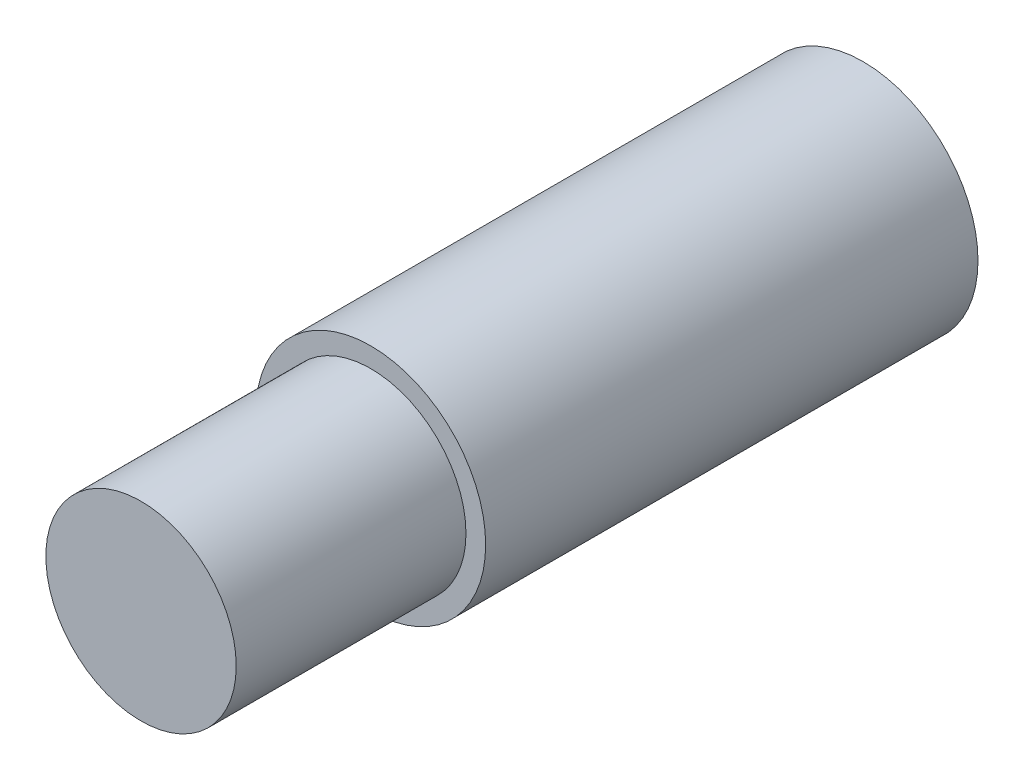
ISO-10303-21;
HEADER;
FILE_DESCRIPTION(('STEP AP214'),'2;1');
FILE_NAME('part.step','',(''),(''),'','','');
FILE_SCHEMA(('AUTOMOTIVE_DESIGN { 1 0 10303 214 1 1 1 1 }'));
ENDSEC;
DATA;
#1=APPLICATION_CONTEXT('core data for automotive mechanical design processes');
#2=APPLICATION_PROTOCOL_DEFINITION('international standard','automotive_design',2000,#1);
#3=PRODUCT_CONTEXT('',#1,'mechanical');
#4=PRODUCT('Part','Part','',(#3));
#5=PRODUCT_RELATED_PRODUCT_CATEGORY('part','',(#4));
#6=PRODUCT_DEFINITION_FORMATION('','',#4);
#7=PRODUCT_DEFINITION_CONTEXT('part definition',#1,'design');
#8=PRODUCT_DEFINITION('design','',#6,#7);
#9=PRODUCT_DEFINITION_SHAPE('','',#8);
#10=(LENGTH_UNIT() NAMED_UNIT(*) SI_UNIT(.MILLI.,.METRE.));
#11=(NAMED_UNIT(*) PLANE_ANGLE_UNIT() SI_UNIT($,.RADIAN.));
#12=(NAMED_UNIT(*) SI_UNIT($,.STERADIAN.) SOLID_ANGLE_UNIT());
#13=UNCERTAINTY_MEASURE_WITH_UNIT(LENGTH_MEASURE(1.E-05),#10,'distance_accuracy_value','');
#14=(GEOMETRIC_REPRESENTATION_CONTEXT(3) GLOBAL_UNCERTAINTY_ASSIGNED_CONTEXT((#13)) GLOBAL_UNIT_ASSIGNED_CONTEXT((#10,
#11,#12)) REPRESENTATION_CONTEXT('',''));
#15=CARTESIAN_POINT('',(0.,0.,0.));
#16=DIRECTION('',(0.,0.,1.));
#17=DIRECTION('',(1.,0.,0.));
#18=AXIS2_PLACEMENT_3D('',#15,#16,#17);
#19=CARTESIAN_POINT('',(0.,0.,15.));
#20=DIRECTION('',(0.,0.,-1.));
#21=DIRECTION('',(-1.,0.,0.));
#22=AXIS2_PLACEMENT_3D('',#19,#20,#21);
#23=CYLINDRICAL_SURFACE('',#22,3.5);
#24=CARTESIAN_POINT('',(0.,0.,15.));
#25=DIRECTION('',(0.,0.,1.));
#26=DIRECTION('',(1.,0.,0.));
#27=AXIS2_PLACEMENT_3D('',#24,#25,#26);
#28=CIRCLE('',#27,3.5);
#29=CARTESIAN_POINT('',(3.5,0.,15.));
#30=VERTEX_POINT('',#29);
#31=EDGE_CURVE('E45',#30,#30,#28,.T.);
#32=ORIENTED_EDGE('',*,*,#31,.F.);
#33=EDGE_LOOP('',(#32));
#34=FACE_BOUND('',#33,.T.);
#35=CARTESIAN_POINT('',(0.,0.,0.));
#36=DIRECTION('',(0.,0.,1.));
#37=DIRECTION('',(1.,0.,0.));
#38=AXIS2_PLACEMENT_3D('',#35,#36,#37);
#39=CIRCLE('',#38,3.5);
#40=CARTESIAN_POINT('',(3.5,0.,0.));
#41=VERTEX_POINT('',#40);
#42=EDGE_CURVE('E40',#41,#41,#39,.T.);
#43=ORIENTED_EDGE('',*,*,#42,.T.);
#44=EDGE_LOOP('',(#43));
#45=FACE_BOUND('',#44,.T.);
#46=ADVANCED_FACE('F37',(#34,#45),#23,.T.);
#47=CARTESIAN_POINT('',(0.,0.,15.));
#48=DIRECTION('',(0.,0.,1.));
#49=DIRECTION('',(1.,0.,0.));
#50=AXIS2_PLACEMENT_3D('',#47,#48,#49);
#51=PLANE('',#50);
#52=CARTESIAN_POINT('',(0.,0.,15.));
#53=DIRECTION('',(0.,0.,1.));
#54=DIRECTION('',(1.,0.,0.));
#55=AXIS2_PLACEMENT_3D('',#52,#53,#54);
#56=CIRCLE('',#55,2.9);
#57=CARTESIAN_POINT('',(2.9,0.,15.));
#58=VERTEX_POINT('',#57);
#59=EDGE_CURVE('E10',#58,#58,#56,.T.);
#60=ORIENTED_EDGE('',*,*,#59,.F.);
#61=EDGE_LOOP('',(#60));
#62=FACE_BOUND('',#61,.T.);
#63=ORIENTED_EDGE('',*,*,#31,.T.);
#64=EDGE_LOOP('',(#63));
#65=FACE_BOUND('',#64,.T.);
#66=ADVANCED_FACE('F65',(#62,#65),#51,.T.);
#67=CARTESIAN_POINT('',(0.,0.,0.));
#68=DIRECTION('',(0.,0.,1.));
#69=DIRECTION('',(1.,0.,0.));
#70=AXIS2_PLACEMENT_3D('',#67,#68,#69);
#71=PLANE('',#70);
#72=ORIENTED_EDGE('',*,*,#42,.F.);
#73=EDGE_LOOP('',(#72));
#74=FACE_BOUND('',#73,.T.);
#75=ADVANCED_FACE('F62',(#74),#71,.F.);
#76=CARTESIAN_POINT('',(0.,0.,22.));
#77=DIRECTION('',(0.,0.,-1.));
#78=DIRECTION('',(-1.,0.,0.));
#79=AXIS2_PLACEMENT_3D('',#76,#77,#78);
#80=CYLINDRICAL_SURFACE('',#79,2.9);
#81=CARTESIAN_POINT('',(0.,0.,22.));
#82=DIRECTION('',(0.,0.,1.));
#83=DIRECTION('',(1.,0.,0.));
#84=AXIS2_PLACEMENT_3D('',#81,#82,#83);
#85=CIRCLE('',#84,2.9);
#86=CARTESIAN_POINT('',(2.9,0.,22.));
#87=VERTEX_POINT('',#86);
#88=EDGE_CURVE('E52',#87,#87,#85,.T.);
#89=ORIENTED_EDGE('',*,*,#88,.F.);
#90=EDGE_LOOP('',(#89));
#91=FACE_BOUND('',#90,.T.);
#92=ORIENTED_EDGE('',*,*,#59,.T.);
#93=EDGE_LOOP('',(#92));
#94=FACE_BOUND('',#93,.T.);
#95=ADVANCED_FACE('F64',(#91,#94),#80,.T.);
#96=CARTESIAN_POINT('',(0.,0.,22.));
#97=DIRECTION('',(0.,0.,1.));
#98=DIRECTION('',(1.,0.,0.));
#99=AXIS2_PLACEMENT_3D('',#96,#97,#98);
#100=PLANE('',#99);
#101=ORIENTED_EDGE('',*,*,#88,.T.);
#102=EDGE_LOOP('',(#101));
#103=FACE_BOUND('',#102,.T.);
#104=ADVANCED_FACE('F70',(#103),#100,.T.);
#105=CLOSED_SHELL('',(#46,#66,#75,#95,#104));
#106=MANIFOLD_SOLID_BREP('B2',#105);
#107=ADVANCED_BREP_SHAPE_REPRESENTATION('',(#18,#106),#14);
#108=SHAPE_DEFINITION_REPRESENTATION(#9,#107);
ENDSEC;
END-ISO-10303-21;
